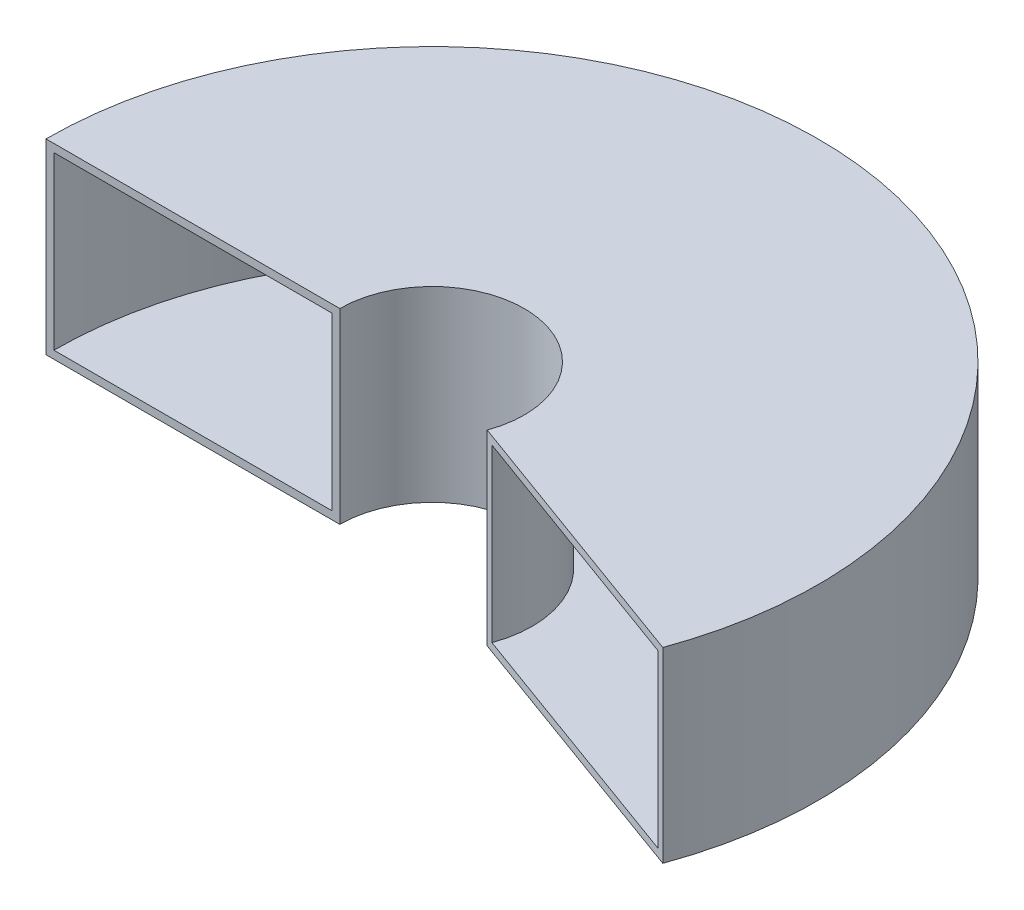
ISO-10303-21;
HEADER;
FILE_DESCRIPTION(('STEP AP214'),'2;1');
FILE_NAME('part.step','',(''),(''),'','','');
FILE_SCHEMA(('AUTOMOTIVE_DESIGN { 1 0 10303 214 1 1 1 1 }'));
ENDSEC;
DATA;
#1=APPLICATION_CONTEXT('core data for automotive mechanical design processes');
#2=APPLICATION_PROTOCOL_DEFINITION('international standard','automotive_design',2000,#1);
#3=PRODUCT_CONTEXT('',#1,'mechanical');
#4=PRODUCT('Part','Part','',(#3));
#5=PRODUCT_RELATED_PRODUCT_CATEGORY('part','',(#4));
#6=PRODUCT_DEFINITION_FORMATION('','',#4);
#7=PRODUCT_DEFINITION_CONTEXT('part definition',#1,'design');
#8=PRODUCT_DEFINITION('design','',#6,#7);
#9=PRODUCT_DEFINITION_SHAPE('','',#8);
#10=(LENGTH_UNIT() NAMED_UNIT(*) SI_UNIT(.MILLI.,.METRE.));
#11=(NAMED_UNIT(*) PLANE_ANGLE_UNIT() SI_UNIT($,.RADIAN.));
#12=(NAMED_UNIT(*) SI_UNIT($,.STERADIAN.) SOLID_ANGLE_UNIT());
#13=UNCERTAINTY_MEASURE_WITH_UNIT(LENGTH_MEASURE(1.E-05),#10,'distance_accuracy_value','');
#14=(GEOMETRIC_REPRESENTATION_CONTEXT(3) GLOBAL_UNCERTAINTY_ASSIGNED_CONTEXT((#13)) GLOBAL_UNIT_ASSIGNED_CONTEXT((#10,
#11,#12)) REPRESENTATION_CONTEXT('',''));
#15=CARTESIAN_POINT('',(0.,0.,0.));
#16=DIRECTION('',(0.,0.,1.));
#17=DIRECTION('',(1.,0.,0.));
#18=AXIS2_PLACEMENT_3D('',#15,#16,#17);
#19=CARTESIAN_POINT('',(81.5697477216811,0.,14.3829473329155));
#20=DIRECTION('',(0.342020143325676,0.,-0.939692620785906));
#21=DIRECTION('',(-0.939692620785906,0.,-0.342020143325676));
#22=AXIS2_PLACEMENT_3D('',#19,#20,#21);
#23=PLANE('',#22);
#24=DIRECTION('',(0.,-1.,0.));
#25=VECTOR('',#24,1.);
#26=CARTESIAN_POINT('',(69.8700466061052,0.,10.1246043770347));
#27=LINE('',#26,#25);
#28=CARTESIAN_POINT('',(69.8700466061052,41.7804679518866,10.1246043770347));
#29=VERTEX_POINT('',#28);
#30=CARTESIAN_POINT('',(69.8700466061052,-18.2094018783984,10.1246043770347));
#31=VERTEX_POINT('',#30);
#32=EDGE_CURVE('E167',#29,#31,#27,.T.);
#33=ORIENTED_EDGE('',*,*,#32,.T.);
#34=DIRECTION('',(-0.939692620785906,0.,-0.342020143325676));
#35=VECTOR('',#34,1.);
#36=CARTESIAN_POINT('',(81.5697477216811,-18.2094018783984,14.3829473329155));
#37=LINE('',#36,#35);
#38=CARTESIAN_POINT('',(158.459621848715,-18.2094018783984,42.3685728316315));
#39=VERTEX_POINT('',#38);
#40=EDGE_CURVE('E171',#39,#31,#37,.T.);
#41=ORIENTED_EDGE('',*,*,#40,.F.);
#42=DIRECTION('',(0.,-1.,0.));
#43=VECTOR('',#42,1.);
#44=CARTESIAN_POINT('',(158.459621848715,0.,42.3685728316315));
#45=LINE('',#44,#43);
#46=CARTESIAN_POINT('',(158.459621848715,41.7804679518866,42.3685728316315));
#47=VERTEX_POINT('',#46);
#48=EDGE_CURVE('E175',#47,#39,#45,.T.);
#49=ORIENTED_EDGE('',*,*,#48,.F.);
#50=DIRECTION('',(-0.939692620785906,0.,-0.342020143325676));
#51=VECTOR('',#50,1.);
#52=CARTESIAN_POINT('',(81.5697477216811,41.7804679518866,14.3829473329155));
#53=LINE('',#52,#51);
#54=EDGE_CURVE('E179',#47,#29,#53,.T.);
#55=ORIENTED_EDGE('',*,*,#54,.T.);
#56=EDGE_LOOP('',(#33,#41,#49,#55));
#57=FACE_BOUND('',#56,.T.);
#58=DIRECTION('',(0.,-1.,0.));
#59=VECTOR('',#58,1.);
#60=CARTESIAN_POINT('',(72.2568658629014,0.,10.9933355410819));
#61=LINE('',#60,#59);
#62=CARTESIAN_POINT('',(72.2568658629014,39.2404679518867,10.9933355410819));
#63=VERTEX_POINT('',#62);
#64=CARTESIAN_POINT('',(72.2568658629014,-15.6694018783984,10.9933355410819));
#65=VERTEX_POINT('',#64);
#66=EDGE_CURVE('E55',#63,#65,#61,.T.);
#67=ORIENTED_EDGE('',*,*,#66,.F.);
#68=DIRECTION('',(-0.939692620785906,0.,-0.342020143325676));
#69=VECTOR('',#68,1.);
#70=CARTESIAN_POINT('',(81.5697477216811,39.2404679518867,14.3829473329155));
#71=LINE('',#70,#69);
#72=CARTESIAN_POINT('',(156.072802591919,39.2404679518867,41.4998416675843));
#73=VERTEX_POINT('',#72);
#74=EDGE_CURVE('E113',#73,#63,#71,.T.);
#75=ORIENTED_EDGE('',*,*,#74,.F.);
#76=DIRECTION('',(0.,-1.,0.));
#77=VECTOR('',#76,1.);
#78=CARTESIAN_POINT('',(156.072802591919,0.,41.4998416675843));
#79=LINE('',#78,#77);
#80=CARTESIAN_POINT('',(156.072802591919,-15.6694018783984,41.4998416675843));
#81=VERTEX_POINT('',#80);
#82=EDGE_CURVE('E136',#73,#81,#79,.T.);
#83=ORIENTED_EDGE('',*,*,#82,.T.);
#84=DIRECTION('',(-0.939692620785906,0.,-0.342020143325676));
#85=VECTOR('',#84,1.);
#86=CARTESIAN_POINT('',(81.5697477216811,-15.6694018783984,14.3829473329155));
#87=LINE('',#86,#85);
#88=EDGE_CURVE('E133',#81,#65,#87,.T.);
#89=ORIENTED_EDGE('',*,*,#88,.T.);
#90=EDGE_LOOP('',(#67,#75,#83,#89));
#91=FACE_BOUND('',#90,.T.);
#92=ADVANCED_FACE('F39',(#57,#91),#23,.F.);
#93=CARTESIAN_POINT('',(0.,0.,0.));
#94=DIRECTION('',(0.,0.,1.));
#95=DIRECTION('',(1.,0.,0.));
#96=AXIS2_PLACEMENT_3D('',#93,#94,#95);
#97=PLANE('',#96);
#98=DIRECTION('',(0.,-1.,0.));
#99=VECTOR('',#98,1.);
#100=CARTESIAN_POINT('',(12.4505618718076,0.,0.));
#101=LINE('',#100,#99);
#102=CARTESIAN_POINT('',(12.4505618718076,41.7804679518867,0.));
#103=VERTEX_POINT('',#102);
#104=CARTESIAN_POINT('',(12.4505618718076,-18.2094018783984,0.));
#105=VERTEX_POINT('',#104);
#106=EDGE_CURVE('E151',#103,#105,#101,.T.);
#107=ORIENTED_EDGE('',*,*,#106,.F.);
#108=DIRECTION('',(1.,0.,0.));
#109=VECTOR('',#108,1.);
#110=CARTESIAN_POINT('',(0.,41.7804679518867,0.));
#111=LINE('',#110,#109);
#112=CARTESIAN_POINT('',(-81.8244949744604,41.7804679518867,0.));
#113=VERTEX_POINT('',#112);
#114=EDGE_CURVE('E163',#113,#103,#111,.T.);
#115=ORIENTED_EDGE('',*,*,#114,.F.);
#116=DIRECTION('',(0.,-1.,0.));
#117=VECTOR('',#116,1.);
#118=CARTESIAN_POINT('',(-81.8244949744604,0.,0.));
#119=LINE('',#118,#117);
#120=CARTESIAN_POINT('',(-81.8244949744604,-18.2094018783984,0.));
#121=VERTEX_POINT('',#120);
#122=EDGE_CURVE('E159',#113,#121,#119,.T.);
#123=ORIENTED_EDGE('',*,*,#122,.T.);
#124=DIRECTION('',(1.,0.,0.));
#125=VECTOR('',#124,1.);
#126=CARTESIAN_POINT('',(0.,-18.2094018783984,0.));
#127=LINE('',#126,#125);
#128=EDGE_CURVE('E155',#121,#105,#127,.T.);
#129=ORIENTED_EDGE('',*,*,#128,.T.);
#130=EDGE_LOOP('',(#107,#115,#123,#129));
#131=FACE_BOUND('',#130,.T.);
#132=DIRECTION('',(1.,0.,0.));
#133=VECTOR('',#132,1.);
#134=CARTESIAN_POINT('',(0.,39.2404679518867,0.));
#135=LINE('',#134,#133);
#136=CARTESIAN_POINT('',(-79.2844949744604,39.2404679518867,0.));
#137=VERTEX_POINT('',#136);
#138=CARTESIAN_POINT('',(9.91056187180756,39.2404679518867,0.));
#139=VERTEX_POINT('',#138);
#140=EDGE_CURVE('E123',#137,#139,#135,.T.);
#141=ORIENTED_EDGE('',*,*,#140,.T.);
#142=DIRECTION('',(0.,-1.,0.));
#143=VECTOR('',#142,1.);
#144=CARTESIAN_POINT('',(9.91056187180756,0.,0.));
#145=LINE('',#144,#143);
#146=CARTESIAN_POINT('',(9.91056187180756,-15.6694018783984,0.));
#147=VERTEX_POINT('',#146);
#148=EDGE_CURVE('E106',#139,#147,#145,.T.);
#149=ORIENTED_EDGE('',*,*,#148,.T.);
#150=DIRECTION('',(1.,0.,0.));
#151=VECTOR('',#150,1.);
#152=CARTESIAN_POINT('',(0.,-15.6694018783984,0.));
#153=LINE('',#152,#151);
#154=CARTESIAN_POINT('',(-79.2844949744604,-15.6694018783984,0.));
#155=VERTEX_POINT('',#154);
#156=EDGE_CURVE('E116',#155,#147,#153,.T.);
#157=ORIENTED_EDGE('',*,*,#156,.F.);
#158=DIRECTION('',(0.,-1.,0.));
#159=VECTOR('',#158,1.);
#160=CARTESIAN_POINT('',(-79.2844949744604,0.,0.));
#161=LINE('',#160,#159);
#162=EDGE_CURVE('E63',#137,#155,#161,.T.);
#163=ORIENTED_EDGE('',*,*,#162,.F.);
#164=EDGE_LOOP('',(#141,#149,#157,#163));
#165=FACE_BOUND('',#164,.T.);
#166=ADVANCED_FACE('F121',(#131,#165),#97,.T.);
#167=CARTESIAN_POINT('',(42.0529246992915,43.7939693524469,0.));
#168=DIRECTION('',(0.,1.,0.));
#169=DIRECTION('',(0.,0.,1.));
#170=AXIS2_PLACEMENT_3D('',#167,#168,#169);
#171=CYLINDRICAL_SURFACE('',#170,29.6023628274839);
#172=CARTESIAN_POINT('',(42.0529246992915,41.7804679518866,0.));
#173=DIRECTION('',(0.,1.,0.));
#174=DIRECTION('',(0.,0.,1.));
#175=AXIS2_PLACEMENT_3D('',#172,#173,#174);
#176=CIRCLE('',#175,29.6023628274839);
#177=EDGE_CURVE('E11',#29,#103,#176,.T.);
#178=ORIENTED_EDGE('',*,*,#177,.T.);
#179=ORIENTED_EDGE('',*,*,#106,.T.);
#180=CARTESIAN_POINT('',(42.0529246992915,-18.2094018783984,0.));
#181=DIRECTION('',(0.,1.,0.));
#182=DIRECTION('',(0.,0.,1.));
#183=AXIS2_PLACEMENT_3D('',#180,#181,#182);
#184=CIRCLE('',#183,29.6023628274839);
#185=EDGE_CURVE('E183',#31,#105,#184,.T.);
#186=ORIENTED_EDGE('',*,*,#185,.F.);
#187=ORIENTED_EDGE('',*,*,#32,.F.);
#188=EDGE_LOOP('',(#178,#179,#186,#187));
#189=FACE_BOUND('',#188,.T.);
#190=ADVANCED_FACE('F200',(#189),#171,.F.);
#191=CARTESIAN_POINT('',(81.5697477216811,41.7804679518866,14.3829473329155));
#192=DIRECTION('',(0.,-1.,0.));
#193=DIRECTION('',(0.,0.,-1.));
#194=AXIS2_PLACEMENT_3D('',#191,#192,#193);
#195=PLANE('',#194);
#196=CARTESIAN_POINT('',(42.0529246992915,41.7804679518866,0.));
#197=DIRECTION('',(0.,1.,0.));
#198=DIRECTION('',(0.,0.,1.));
#199=AXIS2_PLACEMENT_3D('',#196,#197,#198);
#200=CIRCLE('',#199,123.877419673752);
#201=EDGE_CURVE('E48',#47,#113,#200,.T.);
#202=ORIENTED_EDGE('',*,*,#201,.T.);
#203=ORIENTED_EDGE('',*,*,#114,.T.);
#204=ORIENTED_EDGE('',*,*,#177,.F.);
#205=ORIENTED_EDGE('',*,*,#54,.F.);
#206=EDGE_LOOP('',(#202,#203,#204,#205));
#207=FACE_BOUND('',#206,.T.);
#208=ADVANCED_FACE('F41',(#207),#195,.F.);
#209=CARTESIAN_POINT('',(42.0529246992915,43.7939693524469,0.));
#210=DIRECTION('',(0.,1.,0.));
#211=DIRECTION('',(0.,0.,1.));
#212=AXIS2_PLACEMENT_3D('',#209,#210,#211);
#213=CYLINDRICAL_SURFACE('',#212,123.877419673752);
#214=CARTESIAN_POINT('',(42.0529246992915,-18.2094018783984,0.));
#215=DIRECTION('',(0.,1.,0.));
#216=DIRECTION('',(0.,0.,1.));
#217=AXIS2_PLACEMENT_3D('',#214,#215,#216);
#218=CIRCLE('',#217,123.877419673752);
#219=EDGE_CURVE('E186',#39,#121,#218,.T.);
#220=ORIENTED_EDGE('',*,*,#219,.T.);
#221=ORIENTED_EDGE('',*,*,#122,.F.);
#222=ORIENTED_EDGE('',*,*,#201,.F.);
#223=ORIENTED_EDGE('',*,*,#48,.T.);
#224=EDGE_LOOP('',(#220,#221,#222,#223));
#225=FACE_BOUND('',#224,.T.);
#226=ADVANCED_FACE('F196',(#225),#213,.T.);
#227=CARTESIAN_POINT('',(81.5697477216811,-18.2094018783984,14.3829473329155));
#228=DIRECTION('',(0.,-1.,0.));
#229=DIRECTION('',(0.,0.,-1.));
#230=AXIS2_PLACEMENT_3D('',#227,#228,#229);
#231=PLANE('',#230);
#232=ORIENTED_EDGE('',*,*,#40,.T.);
#233=ORIENTED_EDGE('',*,*,#185,.T.);
#234=ORIENTED_EDGE('',*,*,#128,.F.);
#235=ORIENTED_EDGE('',*,*,#219,.F.);
#236=EDGE_LOOP('',(#232,#233,#234,#235));
#237=FACE_BOUND('',#236,.T.);
#238=ADVANCED_FACE('F206',(#237),#231,.T.);
#239=CARTESIAN_POINT('',(42.0529246992915,43.7939693524469,0.));
#240=DIRECTION('',(0.,1.,0.));
#241=DIRECTION('',(0.,0.,1.));
#242=AXIS2_PLACEMENT_3D('',#239,#240,#241);
#243=CYLINDRICAL_SURFACE('',#242,32.142362827484);
#244=CARTESIAN_POINT('',(42.0529246992915,39.2404679518867,0.));
#245=DIRECTION('',(0.,1.,0.));
#246=DIRECTION('',(0.,0.,1.));
#247=AXIS2_PLACEMENT_3D('',#244,#245,#246);
#248=CIRCLE('',#247,32.142362827484);
#249=EDGE_CURVE('E148',#63,#139,#248,.T.);
#250=ORIENTED_EDGE('',*,*,#249,.F.);
#251=ORIENTED_EDGE('',*,*,#66,.T.);
#252=CARTESIAN_POINT('',(42.0529246992915,-15.6694018783984,0.));
#253=DIRECTION('',(0.,1.,0.));
#254=DIRECTION('',(0.,0.,1.));
#255=AXIS2_PLACEMENT_3D('',#252,#253,#254);
#256=CIRCLE('',#255,32.142362827484);
#257=EDGE_CURVE('E102',#65,#147,#256,.T.);
#258=ORIENTED_EDGE('',*,*,#257,.T.);
#259=ORIENTED_EDGE('',*,*,#148,.F.);
#260=EDGE_LOOP('',(#250,#251,#258,#259));
#261=FACE_BOUND('',#260,.T.);
#262=ADVANCED_FACE('F104',(#261),#243,.T.);
#263=CARTESIAN_POINT('',(81.5697477216811,39.2404679518867,14.3829473329155));
#264=DIRECTION('',(0.,-1.,0.));
#265=DIRECTION('',(0.,0.,-1.));
#266=AXIS2_PLACEMENT_3D('',#263,#264,#265);
#267=PLANE('',#266);
#268=CARTESIAN_POINT('',(42.0529246992915,39.2404679518867,0.));
#269=DIRECTION('',(0.,1.,0.));
#270=DIRECTION('',(0.,0.,1.));
#271=AXIS2_PLACEMENT_3D('',#268,#269,#270);
#272=CIRCLE('',#271,121.337419673752);
#273=EDGE_CURVE('E145',#73,#137,#272,.T.);
#274=ORIENTED_EDGE('',*,*,#273,.F.);
#275=ORIENTED_EDGE('',*,*,#74,.T.);
#276=ORIENTED_EDGE('',*,*,#249,.T.);
#277=ORIENTED_EDGE('',*,*,#140,.F.);
#278=EDGE_LOOP('',(#274,#275,#276,#277));
#279=FACE_BOUND('',#278,.T.);
#280=ADVANCED_FACE('F213',(#279),#267,.T.);
#281=CARTESIAN_POINT('',(42.0529246992915,43.7939693524469,0.));
#282=DIRECTION('',(0.,1.,0.));
#283=DIRECTION('',(0.,0.,1.));
#284=AXIS2_PLACEMENT_3D('',#281,#282,#283);
#285=CYLINDRICAL_SURFACE('',#284,121.337419673752);
#286=CARTESIAN_POINT('',(42.0529246992915,-15.6694018783984,0.));
#287=DIRECTION('',(0.,1.,0.));
#288=DIRECTION('',(0.,0.,1.));
#289=AXIS2_PLACEMENT_3D('',#286,#287,#288);
#290=CIRCLE('',#289,121.337419673752);
#291=EDGE_CURVE('E112',#81,#155,#290,.T.);
#292=ORIENTED_EDGE('',*,*,#291,.F.);
#293=ORIENTED_EDGE('',*,*,#82,.F.);
#294=ORIENTED_EDGE('',*,*,#273,.T.);
#295=ORIENTED_EDGE('',*,*,#162,.T.);
#296=EDGE_LOOP('',(#292,#293,#294,#295));
#297=FACE_BOUND('',#296,.T.);
#298=ADVANCED_FACE('F252',(#297),#285,.F.);
#299=CARTESIAN_POINT('',(81.5697477216811,-15.6694018783984,14.3829473329155));
#300=DIRECTION('',(0.,-1.,0.));
#301=DIRECTION('',(0.,0.,-1.));
#302=AXIS2_PLACEMENT_3D('',#299,#300,#301);
#303=PLANE('',#302);
#304=ORIENTED_EDGE('',*,*,#88,.F.);
#305=ORIENTED_EDGE('',*,*,#291,.T.);
#306=ORIENTED_EDGE('',*,*,#156,.T.);
#307=ORIENTED_EDGE('',*,*,#257,.F.);
#308=EDGE_LOOP('',(#304,#305,#306,#307));
#309=FACE_BOUND('',#308,.T.);
#310=ADVANCED_FACE('F117',(#309),#303,.F.);
#311=CLOSED_SHELL('',(#92,#166,#190,#208,#226,#238,#262,#280,#298,#310));
#312=MANIFOLD_SOLID_BREP('B2',#311);
#313=ADVANCED_BREP_SHAPE_REPRESENTATION('',(#18,#312),#14);
#314=SHAPE_DEFINITION_REPRESENTATION(#9,#313);
ENDSEC;
END-ISO-10303-21;
